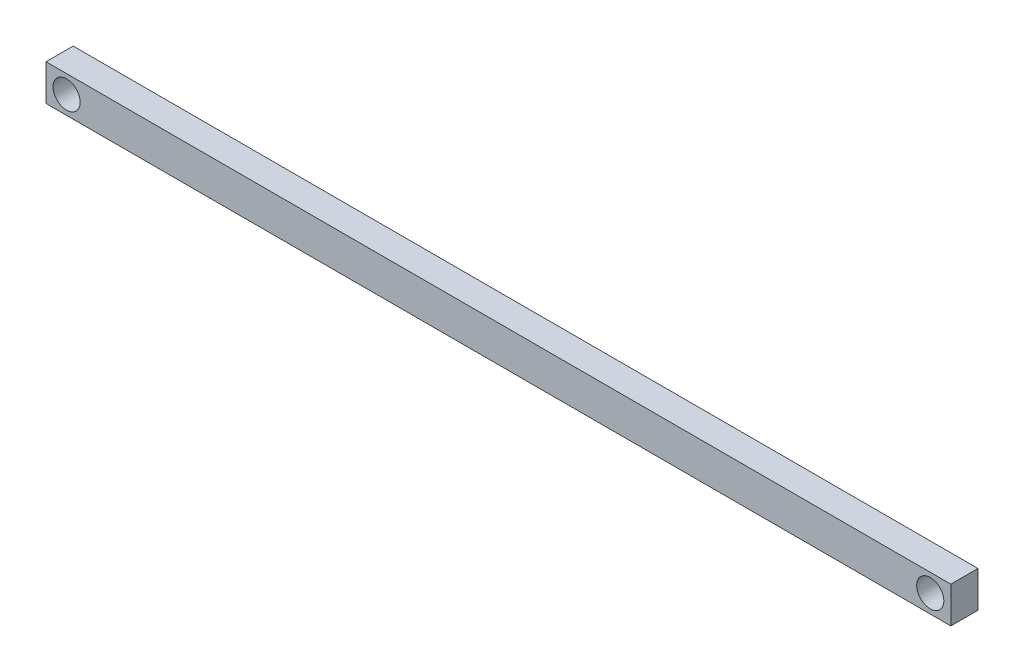
ISO-10303-21;
HEADER;
FILE_DESCRIPTION(('STEP AP214'),'2;1');
FILE_NAME('part.step','',(''),(''),'','','');
FILE_SCHEMA(('AUTOMOTIVE_DESIGN { 1 0 10303 214 1 1 1 1 }'));
ENDSEC;
DATA;
#1=APPLICATION_CONTEXT('core data for automotive mechanical design processes');
#2=APPLICATION_PROTOCOL_DEFINITION('international standard','automotive_design',2000,#1);
#3=PRODUCT_CONTEXT('',#1,'mechanical');
#4=PRODUCT('Part','Part','',(#3));
#5=PRODUCT_RELATED_PRODUCT_CATEGORY('part','',(#4));
#6=PRODUCT_DEFINITION_FORMATION('','',#4);
#7=PRODUCT_DEFINITION_CONTEXT('part definition',#1,'design');
#8=PRODUCT_DEFINITION('design','',#6,#7);
#9=PRODUCT_DEFINITION_SHAPE('','',#8);
#10=(LENGTH_UNIT() NAMED_UNIT(*) SI_UNIT(.MILLI.,.METRE.));
#11=(NAMED_UNIT(*) PLANE_ANGLE_UNIT() SI_UNIT($,.RADIAN.));
#12=(NAMED_UNIT(*) SI_UNIT($,.STERADIAN.) SOLID_ANGLE_UNIT());
#13=UNCERTAINTY_MEASURE_WITH_UNIT(LENGTH_MEASURE(1.E-05),#10,'distance_accuracy_value','');
#14=(GEOMETRIC_REPRESENTATION_CONTEXT(3) GLOBAL_UNCERTAINTY_ASSIGNED_CONTEXT((#13)) GLOBAL_UNIT_ASSIGNED_CONTEXT((#10,
#11,#12)) REPRESENTATION_CONTEXT('',''));
#15=CARTESIAN_POINT('',(0.,0.,0.));
#16=DIRECTION('',(0.,0.,1.));
#17=DIRECTION('',(1.,0.,0.));
#18=AXIS2_PLACEMENT_3D('',#15,#16,#17);
#19=CARTESIAN_POINT('',(0.,0.,15.));
#20=DIRECTION('',(0.,0.,1.));
#21=DIRECTION('',(1.,0.,0.));
#22=AXIS2_PLACEMENT_3D('',#19,#20,#21);
#23=PLANE('',#22);
#24=CARTESIAN_POINT('',(-238.62,0.,15.));
#25=DIRECTION('',(0.,0.,1.));
#26=DIRECTION('',(1.,0.,0.));
#27=AXIS2_PLACEMENT_3D('',#24,#25,#26);
#28=CIRCLE('',#27,7.50000000000001);
#29=CARTESIAN_POINT('',(-231.12,0.,15.));
#30=VERTEX_POINT('',#29);
#31=EDGE_CURVE('E101',#30,#30,#28,.T.);
#32=ORIENTED_EDGE('',*,*,#31,.F.);
#33=EDGE_LOOP('',(#32));
#34=FACE_BOUND('',#33,.T.);
#35=DIRECTION('',(0.,1.,0.));
#36=VECTOR('',#35,1.);
#37=CARTESIAN_POINT('',(250.,10.,15.));
#38=LINE('',#37,#36);
#39=CARTESIAN_POINT('',(250.,-10.,15.));
#40=VERTEX_POINT('',#39);
#41=CARTESIAN_POINT('',(250.,10.,15.));
#42=VERTEX_POINT('',#41);
#43=EDGE_CURVE('E86',#40,#42,#38,.T.);
#44=ORIENTED_EDGE('',*,*,#43,.T.);
#45=DIRECTION('',(-1.,0.,0.));
#46=VECTOR('',#45,1.);
#47=CARTESIAN_POINT('',(-250.,10.,15.));
#48=LINE('',#47,#46);
#49=CARTESIAN_POINT('',(-250.,10.,15.));
#50=VERTEX_POINT('',#49);
#51=EDGE_CURVE('E81',#42,#50,#48,.T.);
#52=ORIENTED_EDGE('',*,*,#51,.T.);
#53=DIRECTION('',(0.,-1.,0.));
#54=VECTOR('',#53,1.);
#55=CARTESIAN_POINT('',(-250.,10.,15.));
#56=LINE('',#55,#54);
#57=CARTESIAN_POINT('',(-250.,-10.,15.));
#58=VERTEX_POINT('',#57);
#59=EDGE_CURVE('E84',#50,#58,#56,.T.);
#60=ORIENTED_EDGE('',*,*,#59,.T.);
#61=DIRECTION('',(1.,0.,0.));
#62=VECTOR('',#61,1.);
#63=CARTESIAN_POINT('',(-250.,-10.,15.));
#64=LINE('',#63,#62);
#65=EDGE_CURVE('E51',#58,#40,#64,.T.);
#66=ORIENTED_EDGE('',*,*,#65,.T.);
#67=EDGE_LOOP('',(#44,#52,#60,#66));
#68=FACE_BOUND('',#67,.T.);
#69=CARTESIAN_POINT('',(238.62,0.,15.));
#70=DIRECTION('',(0.,0.,1.));
#71=DIRECTION('',(1.,0.,0.));
#72=AXIS2_PLACEMENT_3D('',#69,#70,#71);
#73=CIRCLE('',#72,7.50000000000001);
#74=CARTESIAN_POINT('',(246.12,0.,15.));
#75=VERTEX_POINT('',#74);
#76=EDGE_CURVE('E116',#75,#75,#73,.T.);
#77=ORIENTED_EDGE('',*,*,#76,.F.);
#78=EDGE_LOOP('',(#77));
#79=FACE_BOUND('',#78,.T.);
#80=ADVANCED_FACE('F34',(#34,#68,#79),#23,.T.);
#81=CARTESIAN_POINT('',(0.,0.,0.));
#82=DIRECTION('',(0.,0.,1.));
#83=DIRECTION('',(1.,0.,0.));
#84=AXIS2_PLACEMENT_3D('',#81,#82,#83);
#85=PLANE('',#84);
#86=DIRECTION('',(0.,1.,0.));
#87=VECTOR('',#86,1.);
#88=CARTESIAN_POINT('',(250.,10.,0.));
#89=LINE('',#88,#87);
#90=CARTESIAN_POINT('',(250.,-10.,0.));
#91=VERTEX_POINT('',#90);
#92=CARTESIAN_POINT('',(250.,10.,0.));
#93=VERTEX_POINT('',#92);
#94=EDGE_CURVE('E98',#91,#93,#89,.T.);
#95=ORIENTED_EDGE('',*,*,#94,.F.);
#96=DIRECTION('',(1.,0.,0.));
#97=VECTOR('',#96,1.);
#98=CARTESIAN_POINT('',(-250.,-10.,0.));
#99=LINE('',#98,#97);
#100=CARTESIAN_POINT('',(-250.,-10.,0.));
#101=VERTEX_POINT('',#100);
#102=EDGE_CURVE('E74',#101,#91,#99,.T.);
#103=ORIENTED_EDGE('',*,*,#102,.F.);
#104=DIRECTION('',(0.,-1.,0.));
#105=VECTOR('',#104,1.);
#106=CARTESIAN_POINT('',(-250.,10.,0.));
#107=LINE('',#106,#105);
#108=CARTESIAN_POINT('',(-250.,10.,0.));
#109=VERTEX_POINT('',#108);
#110=EDGE_CURVE('E68',#109,#101,#107,.T.);
#111=ORIENTED_EDGE('',*,*,#110,.F.);
#112=DIRECTION('',(-1.,0.,0.));
#113=VECTOR('',#112,1.);
#114=CARTESIAN_POINT('',(-250.,10.,0.));
#115=LINE('',#114,#113);
#116=EDGE_CURVE('E90',#93,#109,#115,.T.);
#117=ORIENTED_EDGE('',*,*,#116,.F.);
#118=EDGE_LOOP('',(#95,#103,#111,#117));
#119=FACE_BOUND('',#118,.T.);
#120=CARTESIAN_POINT('',(-238.62,0.,0.));
#121=DIRECTION('',(0.,0.,1.));
#122=DIRECTION('',(1.,0.,0.));
#123=AXIS2_PLACEMENT_3D('',#120,#121,#122);
#124=CIRCLE('',#123,7.50000000000001);
#125=CARTESIAN_POINT('',(-231.12,0.,0.));
#126=VERTEX_POINT('',#125);
#127=EDGE_CURVE('E113',#126,#126,#124,.T.);
#128=ORIENTED_EDGE('',*,*,#127,.T.);
#129=EDGE_LOOP('',(#128));
#130=FACE_BOUND('',#129,.T.);
#131=CARTESIAN_POINT('',(238.62,0.,0.));
#132=DIRECTION('',(0.,0.,1.));
#133=DIRECTION('',(1.,0.,0.));
#134=AXIS2_PLACEMENT_3D('',#131,#132,#133);
#135=CIRCLE('',#134,7.50000000000001);
#136=CARTESIAN_POINT('',(246.12,0.,0.));
#137=VERTEX_POINT('',#136);
#138=EDGE_CURVE('E119',#137,#137,#135,.T.);
#139=ORIENTED_EDGE('',*,*,#138,.T.);
#140=EDGE_LOOP('',(#139));
#141=FACE_BOUND('',#140,.T.);
#142=ADVANCED_FACE('F109',(#119,#130,#141),#85,.F.);
#143=CARTESIAN_POINT('',(250.,10.,15.));
#144=DIRECTION('',(-1.,0.,0.));
#145=DIRECTION('',(0.,0.,1.));
#146=AXIS2_PLACEMENT_3D('',#143,#144,#145);
#147=PLANE('',#146);
#148=ORIENTED_EDGE('',*,*,#94,.T.);
#149=DIRECTION('',(0.,0.,-1.));
#150=VECTOR('',#149,1.);
#151=CARTESIAN_POINT('',(250.,10.,15.));
#152=LINE('',#151,#150);
#153=EDGE_CURVE('E11',#42,#93,#152,.T.);
#154=ORIENTED_EDGE('',*,*,#153,.F.);
#155=ORIENTED_EDGE('',*,*,#43,.F.);
#156=DIRECTION('',(0.,0.,-1.));
#157=VECTOR('',#156,1.);
#158=CARTESIAN_POINT('',(250.,-10.,15.));
#159=LINE('',#158,#157);
#160=EDGE_CURVE('E94',#40,#91,#159,.T.);
#161=ORIENTED_EDGE('',*,*,#160,.T.);
#162=EDGE_LOOP('',(#148,#154,#155,#161));
#163=FACE_BOUND('',#162,.T.);
#164=ADVANCED_FACE('F36',(#163),#147,.F.);
#165=CARTESIAN_POINT('',(-250.,10.,15.));
#166=DIRECTION('',(0.,-1.,0.));
#167=DIRECTION('',(0.,0.,-1.));
#168=AXIS2_PLACEMENT_3D('',#165,#166,#167);
#169=PLANE('',#168);
#170=ORIENTED_EDGE('',*,*,#116,.T.);
#171=DIRECTION('',(0.,0.,-1.));
#172=VECTOR('',#171,1.);
#173=CARTESIAN_POINT('',(-250.,10.,15.));
#174=LINE('',#173,#172);
#175=EDGE_CURVE('E43',#50,#109,#174,.T.);
#176=ORIENTED_EDGE('',*,*,#175,.F.);
#177=ORIENTED_EDGE('',*,*,#51,.F.);
#178=ORIENTED_EDGE('',*,*,#153,.T.);
#179=EDGE_LOOP('',(#170,#176,#177,#178));
#180=FACE_BOUND('',#179,.T.);
#181=ADVANCED_FACE('F89',(#180),#169,.F.);
#182=CARTESIAN_POINT('',(-250.,10.,15.));
#183=DIRECTION('',(1.,0.,0.));
#184=DIRECTION('',(0.,0.,-1.));
#185=AXIS2_PLACEMENT_3D('',#182,#183,#184);
#186=PLANE('',#185);
#187=ORIENTED_EDGE('',*,*,#110,.T.);
#188=DIRECTION('',(0.,0.,-1.));
#189=VECTOR('',#188,1.);
#190=CARTESIAN_POINT('',(-250.,-10.,15.));
#191=LINE('',#190,#189);
#192=EDGE_CURVE('E91',#58,#101,#191,.T.);
#193=ORIENTED_EDGE('',*,*,#192,.F.);
#194=ORIENTED_EDGE('',*,*,#59,.F.);
#195=ORIENTED_EDGE('',*,*,#175,.T.);
#196=EDGE_LOOP('',(#187,#193,#194,#195));
#197=FACE_BOUND('',#196,.T.);
#198=ADVANCED_FACE('F92',(#197),#186,.F.);
#199=CARTESIAN_POINT('',(-250.,-10.,15.));
#200=DIRECTION('',(0.,1.,0.));
#201=DIRECTION('',(0.,0.,1.));
#202=AXIS2_PLACEMENT_3D('',#199,#200,#201);
#203=PLANE('',#202);
#204=ORIENTED_EDGE('',*,*,#102,.T.);
#205=ORIENTED_EDGE('',*,*,#160,.F.);
#206=ORIENTED_EDGE('',*,*,#65,.F.);
#207=ORIENTED_EDGE('',*,*,#192,.T.);
#208=EDGE_LOOP('',(#204,#205,#206,#207));
#209=FACE_BOUND('',#208,.T.);
#210=ADVANCED_FACE('F106',(#209),#203,.F.);
#211=CARTESIAN_POINT('',(-238.62,0.,15.));
#212=DIRECTION('',(0.,0.,-1.));
#213=DIRECTION('',(-1.,0.,0.));
#214=AXIS2_PLACEMENT_3D('',#211,#212,#213);
#215=CYLINDRICAL_SURFACE('',#214,7.50000000000001);
#216=ORIENTED_EDGE('',*,*,#31,.T.);
#217=EDGE_LOOP('',(#216));
#218=FACE_BOUND('',#217,.T.);
#219=ORIENTED_EDGE('',*,*,#127,.F.);
#220=EDGE_LOOP('',(#219));
#221=FACE_BOUND('',#220,.T.);
#222=ADVANCED_FACE('F136',(#218,#221),#215,.F.);
#223=CARTESIAN_POINT('',(238.62,0.,15.));
#224=DIRECTION('',(0.,0.,-1.));
#225=DIRECTION('',(-1.,0.,0.));
#226=AXIS2_PLACEMENT_3D('',#223,#224,#225);
#227=CYLINDRICAL_SURFACE('',#226,7.50000000000001);
#228=ORIENTED_EDGE('',*,*,#76,.T.);
#229=EDGE_LOOP('',(#228));
#230=FACE_BOUND('',#229,.T.);
#231=ORIENTED_EDGE('',*,*,#138,.F.);
#232=EDGE_LOOP('',(#231));
#233=FACE_BOUND('',#232,.T.);
#234=ADVANCED_FACE('F125',(#230,#233),#227,.F.);
#235=CLOSED_SHELL('',(#80,#142,#164,#181,#198,#210,#222,#234));
#236=MANIFOLD_SOLID_BREP('B2',#235);
#237=ADVANCED_BREP_SHAPE_REPRESENTATION('',(#18,#236),#14);
#238=SHAPE_DEFINITION_REPRESENTATION(#9,#237);
ENDSEC;
END-ISO-10303-21;
